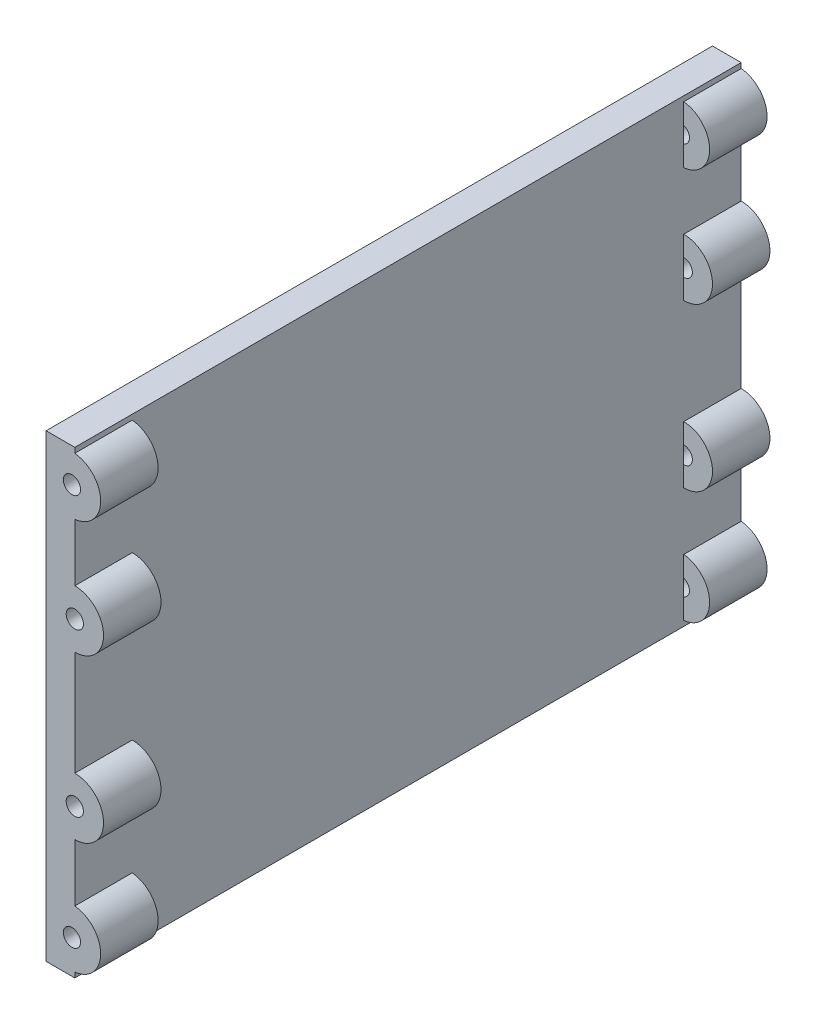
ISO-10303-21;
HEADER;
FILE_DESCRIPTION(('STEP AP214'),'2;1');
FILE_NAME('part.step','',(''),(''),'','','');
FILE_SCHEMA(('AUTOMOTIVE_DESIGN { 1 0 10303 214 1 1 1 1 }'));
ENDSEC;
DATA;
#1=APPLICATION_CONTEXT('core data for automotive mechanical design processes');
#2=APPLICATION_PROTOCOL_DEFINITION('international standard','automotive_design',2000,#1);
#3=PRODUCT_CONTEXT('',#1,'mechanical');
#4=PRODUCT('Part','Part','',(#3));
#5=PRODUCT_RELATED_PRODUCT_CATEGORY('part','',(#4));
#6=PRODUCT_DEFINITION_FORMATION('','',#4);
#7=PRODUCT_DEFINITION_CONTEXT('part definition',#1,'design');
#8=PRODUCT_DEFINITION('design','',#6,#7);
#9=PRODUCT_DEFINITION_SHAPE('','',#8);
#10=(LENGTH_UNIT() NAMED_UNIT(*) SI_UNIT(.MILLI.,.METRE.));
#11=(NAMED_UNIT(*) PLANE_ANGLE_UNIT() SI_UNIT($,.RADIAN.));
#12=(NAMED_UNIT(*) SI_UNIT($,.STERADIAN.) SOLID_ANGLE_UNIT());
#13=UNCERTAINTY_MEASURE_WITH_UNIT(LENGTH_MEASURE(1.E-05),#10,'distance_accuracy_value','');
#14=(GEOMETRIC_REPRESENTATION_CONTEXT(3) GLOBAL_UNCERTAINTY_ASSIGNED_CONTEXT((#13)) GLOBAL_UNIT_ASSIGNED_CONTEXT((#10,
#11,#12)) REPRESENTATION_CONTEXT('',''));
#15=CARTESIAN_POINT('',(0.,0.,0.));
#16=DIRECTION('',(0.,0.,1.));
#17=DIRECTION('',(1.,0.,0.));
#18=AXIS2_PLACEMENT_3D('',#15,#16,#17);
#19=CARTESIAN_POINT('',(5.,0.,0.));
#20=DIRECTION('',(-1.,0.,0.));
#21=DIRECTION('',(0.,0.,1.));
#22=AXIS2_PLACEMENT_3D('',#19,#20,#21);
#23=PLANE('',#22);
#24=DIRECTION('',(0.,1.,0.));
#25=VECTOR('',#24,1.);
#26=CARTESIAN_POINT('',(5.,0.,-9.99999999999999));
#27=LINE('',#26,#25);
#28=CARTESIAN_POINT('',(5.,4.46125075255755,-9.99999999999999));
#29=VERTEX_POINT('',#28);
#30=CARTESIAN_POINT('',(5.,7.28967787730365,-9.99999999999999));
#31=VERTEX_POINT('',#30);
#32=EDGE_CURVE('E221',#29,#31,#27,.T.);
#33=ORIENTED_EDGE('',*,*,#32,.F.);
#34=DIRECTION('',(0.,1.,0.));
#35=VECTOR('',#34,1.);
#36=CARTESIAN_POINT('',(5.,0.,-10.));
#37=LINE('',#36,#35);
#38=CARTESIAN_POINT('',(5.,0.900527129397512,-10.));
#39=VERTEX_POINT('',#38);
#40=EDGE_CURVE('E244',#39,#29,#37,.T.);
#41=ORIENTED_EDGE('',*,*,#40,.F.);
#42=DIRECTION('',(0.,0.,1.));
#43=VECTOR('',#42,1.);
#44=CARTESIAN_POINT('',(5.,0.900527129397512,-10.));
#45=LINE('',#44,#43);
#46=CARTESIAN_POINT('',(5.,0.900527129397512,0.));
#47=VERTEX_POINT('',#46);
#48=EDGE_CURVE('E251',#47,#39,#45,.F.);
#49=ORIENTED_EDGE('',*,*,#48,.F.);
#50=DIRECTION('',(0.,-1.,0.));
#51=VECTOR('',#50,1.);
#52=CARTESIAN_POINT('',(5.,0.,0.));
#53=LINE('',#52,#51);
#54=CARTESIAN_POINT('',(5.,0.,0.));
#55=VERTEX_POINT('',#54);
#56=EDGE_CURVE('E414',#47,#55,#53,.T.);
#57=ORIENTED_EDGE('',*,*,#56,.T.);
#58=DIRECTION('',(0.,0.,-1.));
#59=VECTOR('',#58,1.);
#60=CARTESIAN_POINT('',(5.,0.,0.));
#61=LINE('',#60,#59);
#62=CARTESIAN_POINT('',(5.,0.,-116.));
#63=VERTEX_POINT('',#62);
#64=EDGE_CURVE('E412',#55,#63,#61,.T.);
#65=ORIENTED_EDGE('',*,*,#64,.T.);
#66=DIRECTION('',(0.,1.,0.));
#67=VECTOR('',#66,1.);
#68=CARTESIAN_POINT('',(5.,0.,-116.));
#69=LINE('',#68,#67);
#70=CARTESIAN_POINT('',(5.,0.900527129397512,-116.));
#71=VERTEX_POINT('',#70);
#72=EDGE_CURVE('E418',#63,#71,#69,.T.);
#73=ORIENTED_EDGE('',*,*,#72,.T.);
#74=DIRECTION('',(0.,0.,-1.));
#75=VECTOR('',#74,1.);
#76=CARTESIAN_POINT('',(5.,0.900527129397512,-106.));
#77=LINE('',#76,#75);
#78=CARTESIAN_POINT('',(5.,0.900527129397512,-106.));
#79=VERTEX_POINT('',#78);
#80=EDGE_CURVE('E344',#71,#79,#77,.F.);
#81=ORIENTED_EDGE('',*,*,#80,.T.);
#82=DIRECTION('',(0.,-1.,0.));
#83=VECTOR('',#82,1.);
#84=CARTESIAN_POINT('',(5.,0.,-106.));
#85=LINE('',#84,#83);
#86=CARTESIAN_POINT('',(5.,4.46125075255755,-106.));
#87=VERTEX_POINT('',#86);
#88=EDGE_CURVE('E339',#87,#79,#85,.T.);
#89=ORIENTED_EDGE('',*,*,#88,.F.);
#90=DIRECTION('',(0.,-1.,0.));
#91=VECTOR('',#90,1.);
#92=CARTESIAN_POINT('',(5.,0.,-106.));
#93=LINE('',#92,#91);
#94=CARTESIAN_POINT('',(5.,7.28967787730365,-106.));
#95=VERTEX_POINT('',#94);
#96=EDGE_CURVE('E321',#95,#87,#93,.T.);
#97=ORIENTED_EDGE('',*,*,#96,.F.);
#98=CARTESIAN_POINT('',(5.,10.8504015004637,-106.));
#99=VERTEX_POINT('',#98);
#100=EDGE_CURVE('E52',#99,#95,#85,.T.);
#101=ORIENTED_EDGE('',*,*,#100,.F.);
#102=DIRECTION('',(0.,0.,-1.));
#103=VECTOR('',#102,1.);
#104=CARTESIAN_POINT('',(5.,10.8504015004637,-106.));
#105=LINE('',#104,#103);
#106=CARTESIAN_POINT('',(5.,10.8504015004637,-116.));
#107=VERTEX_POINT('',#106);
#108=EDGE_CURVE('E346',#99,#107,#105,.T.);
#109=ORIENTED_EDGE('',*,*,#108,.T.);
#110=CARTESIAN_POINT('',(5.,20.8754643149307,-116.));
#111=VERTEX_POINT('',#110);
#112=EDGE_CURVE('E421',#107,#111,#69,.T.);
#113=ORIENTED_EDGE('',*,*,#112,.T.);
#114=DIRECTION('',(0.,0.,-1.));
#115=VECTOR('',#114,1.);
#116=CARTESIAN_POINT('',(5.,20.8754643149307,-106.));
#117=LINE('',#116,#115);
#118=CARTESIAN_POINT('',(5.,20.8754643149307,-106.));
#119=VERTEX_POINT('',#118);
#120=EDGE_CURVE('E404',#111,#119,#117,.F.);
#121=ORIENTED_EDGE('',*,*,#120,.T.);
#122=DIRECTION('',(0.,-1.,0.));
#123=VECTOR('',#122,1.);
#124=CARTESIAN_POINT('',(5.,0.,-106.));
#125=LINE('',#124,#123);
#126=CARTESIAN_POINT('',(5.,24.3754643149307,-106.));
#127=VERTEX_POINT('',#126);
#128=EDGE_CURVE('E398',#127,#119,#125,.T.);
#129=ORIENTED_EDGE('',*,*,#128,.F.);
#130=DIRECTION('',(0.,-1.,0.));
#131=VECTOR('',#130,1.);
#132=CARTESIAN_POINT('',(5.,0.,-106.));
#133=LINE('',#132,#131);
#134=CARTESIAN_POINT('',(5.,27.3754643149307,-106.));
#135=VERTEX_POINT('',#134);
#136=EDGE_CURVE('E327',#135,#127,#133,.T.);
#137=ORIENTED_EDGE('',*,*,#136,.F.);
#138=CARTESIAN_POINT('',(5.,30.8754643149307,-106.));
#139=VERTEX_POINT('',#138);
#140=EDGE_CURVE('E403',#139,#135,#125,.T.);
#141=ORIENTED_EDGE('',*,*,#140,.F.);
#142=DIRECTION('',(0.,0.,-1.));
#143=VECTOR('',#142,1.);
#144=CARTESIAN_POINT('',(5.,30.8754643149307,-106.));
#145=LINE('',#144,#143);
#146=CARTESIAN_POINT('',(5.,30.8754643149307,-116.));
#147=VERTEX_POINT('',#146);
#148=EDGE_CURVE('E406',#139,#147,#145,.T.);
#149=ORIENTED_EDGE('',*,*,#148,.T.);
#150=CARTESIAN_POINT('',(5.,49.1245356850693,-116.));
#151=VERTEX_POINT('',#150);
#152=EDGE_CURVE('E422',#147,#151,#69,.T.);
#153=ORIENTED_EDGE('',*,*,#152,.T.);
#154=DIRECTION('',(0.,0.,-1.));
#155=VECTOR('',#154,1.);
#156=CARTESIAN_POINT('',(5.,49.1245356850693,-106.));
#157=LINE('',#156,#155);
#158=CARTESIAN_POINT('',(5.,49.1245356850693,-106.));
#159=VERTEX_POINT('',#158);
#160=EDGE_CURVE('E364',#151,#159,#157,.F.);
#161=ORIENTED_EDGE('',*,*,#160,.T.);
#162=DIRECTION('',(0.,-1.,0.));
#163=VECTOR('',#162,1.);
#164=CARTESIAN_POINT('',(5.,0.,-106.));
#165=LINE('',#164,#163);
#166=CARTESIAN_POINT('',(5.,52.6245356850693,-106.));
#167=VERTEX_POINT('',#166);
#168=EDGE_CURVE('E358',#167,#159,#165,.T.);
#169=ORIENTED_EDGE('',*,*,#168,.F.);
#170=DIRECTION('',(0.,-1.,0.));
#171=VECTOR('',#170,1.);
#172=CARTESIAN_POINT('',(5.,0.,-106.));
#173=LINE('',#172,#171);
#174=CARTESIAN_POINT('',(5.,55.6245356850693,-106.));
#175=VERTEX_POINT('',#174);
#176=EDGE_CURVE('E323',#175,#167,#173,.T.);
#177=ORIENTED_EDGE('',*,*,#176,.F.);
#178=CARTESIAN_POINT('',(5.,59.1245356850693,-106.));
#179=VERTEX_POINT('',#178);
#180=EDGE_CURVE('E363',#179,#175,#165,.T.);
#181=ORIENTED_EDGE('',*,*,#180,.F.);
#182=DIRECTION('',(0.,0.,-1.));
#183=VECTOR('',#182,1.);
#184=CARTESIAN_POINT('',(5.,59.1245356850693,-106.));
#185=LINE('',#184,#183);
#186=CARTESIAN_POINT('',(5.,59.1245356850693,-116.));
#187=VERTEX_POINT('',#186);
#188=EDGE_CURVE('E366',#179,#187,#185,.T.);
#189=ORIENTED_EDGE('',*,*,#188,.T.);
#190=CARTESIAN_POINT('',(5.,69.1495984995363,-116.));
#191=VERTEX_POINT('',#190);
#192=EDGE_CURVE('E466',#187,#191,#69,.T.);
#193=ORIENTED_EDGE('',*,*,#192,.T.);
#194=DIRECTION('',(0.,0.,-1.));
#195=VECTOR('',#194,1.);
#196=CARTESIAN_POINT('',(5.,69.1495984995363,-106.));
#197=LINE('',#196,#195);
#198=CARTESIAN_POINT('',(5.,69.1495984995363,-106.));
#199=VERTEX_POINT('',#198);
#200=EDGE_CURVE('E384',#191,#199,#197,.F.);
#201=ORIENTED_EDGE('',*,*,#200,.T.);
#202=DIRECTION('',(0.,-1.,0.));
#203=VECTOR('',#202,1.);
#204=CARTESIAN_POINT('',(5.,0.,-106.));
#205=LINE('',#204,#203);
#206=CARTESIAN_POINT('',(5.,72.7103221226963,-106.));
#207=VERTEX_POINT('',#206);
#208=EDGE_CURVE('E378',#207,#199,#205,.T.);
#209=ORIENTED_EDGE('',*,*,#208,.F.);
#210=DIRECTION('',(0.,-1.,0.));
#211=VECTOR('',#210,1.);
#212=CARTESIAN_POINT('',(5.,0.,-106.));
#213=LINE('',#212,#211);
#214=CARTESIAN_POINT('',(5.,75.5387492474426,-106.));
#215=VERTEX_POINT('',#214);
#216=EDGE_CURVE('E325',#215,#207,#213,.T.);
#217=ORIENTED_EDGE('',*,*,#216,.F.);
#218=CARTESIAN_POINT('',(5.,79.0994728706025,-106.));
#219=VERTEX_POINT('',#218);
#220=EDGE_CURVE('E383',#219,#215,#205,.T.);
#221=ORIENTED_EDGE('',*,*,#220,.F.);
#222=DIRECTION('',(0.,0.,-1.));
#223=VECTOR('',#222,1.);
#224=CARTESIAN_POINT('',(5.,79.0994728706025,-106.));
#225=LINE('',#224,#223);
#226=CARTESIAN_POINT('',(5.,79.0994728706025,-116.));
#227=VERTEX_POINT('',#226);
#228=EDGE_CURVE('E386',#219,#227,#225,.T.);
#229=ORIENTED_EDGE('',*,*,#228,.T.);
#230=CARTESIAN_POINT('',(5.,80.,-116.));
#231=VERTEX_POINT('',#230);
#232=EDGE_CURVE('E417',#227,#231,#69,.T.);
#233=ORIENTED_EDGE('',*,*,#232,.T.);
#234=DIRECTION('',(0.,0.,1.));
#235=VECTOR('',#234,1.);
#236=CARTESIAN_POINT('',(5.,80.,0.));
#237=LINE('',#236,#235);
#238=CARTESIAN_POINT('',(5.,80.,0.));
#239=VERTEX_POINT('',#238);
#240=EDGE_CURVE('E420',#231,#239,#237,.T.);
#241=ORIENTED_EDGE('',*,*,#240,.T.);
#242=CARTESIAN_POINT('',(5.,79.0994728706025,0.));
#243=VERTEX_POINT('',#242);
#244=EDGE_CURVE('E409',#239,#243,#53,.T.);
#245=ORIENTED_EDGE('',*,*,#244,.T.);
#246=DIRECTION('',(0.,0.,1.));
#247=VECTOR('',#246,1.);
#248=CARTESIAN_POINT('',(5.,79.0994728706025,-10.));
#249=LINE('',#248,#247);
#250=CARTESIAN_POINT('',(5.,79.0994728706025,-10.));
#251=VERTEX_POINT('',#250);
#252=EDGE_CURVE('E284',#251,#243,#249,.T.);
#253=ORIENTED_EDGE('',*,*,#252,.F.);
#254=DIRECTION('',(0.,1.,0.));
#255=VECTOR('',#254,1.);
#256=CARTESIAN_POINT('',(5.,0.,-10.));
#257=LINE('',#256,#255);
#258=CARTESIAN_POINT('',(5.,75.5387492474426,-9.99999999999999));
#259=VERTEX_POINT('',#258);
#260=EDGE_CURVE('E289',#259,#251,#257,.T.);
#261=ORIENTED_EDGE('',*,*,#260,.F.);
#262=DIRECTION('',(0.,1.,0.));
#263=VECTOR('',#262,1.);
#264=CARTESIAN_POINT('',(5.,0.,-9.99999999999999));
#265=LINE('',#264,#263);
#266=CARTESIAN_POINT('',(5.,72.7103221226963,-9.99999999999999));
#267=VERTEX_POINT('',#266);
#268=EDGE_CURVE('E573',#267,#259,#265,.T.);
#269=ORIENTED_EDGE('',*,*,#268,.F.);
#270=CARTESIAN_POINT('',(5.,69.1495984995363,-10.));
#271=VERTEX_POINT('',#270);
#272=EDGE_CURVE('E291',#271,#267,#257,.T.);
#273=ORIENTED_EDGE('',*,*,#272,.F.);
#274=DIRECTION('',(0.,0.,1.));
#275=VECTOR('',#274,1.);
#276=CARTESIAN_POINT('',(5.,69.1495984995363,-10.));
#277=LINE('',#276,#275);
#278=CARTESIAN_POINT('',(5.,69.1495984995363,0.));
#279=VERTEX_POINT('',#278);
#280=EDGE_CURVE('E287',#279,#271,#277,.F.);
#281=ORIENTED_EDGE('',*,*,#280,.F.);
#282=CARTESIAN_POINT('',(5.,59.1245356850693,0.));
#283=VERTEX_POINT('',#282);
#284=EDGE_CURVE('E413',#279,#283,#53,.T.);
#285=ORIENTED_EDGE('',*,*,#284,.T.);
#286=DIRECTION('',(0.,0.,1.));
#287=VECTOR('',#286,1.);
#288=CARTESIAN_POINT('',(5.,59.1245356850693,-10.));
#289=LINE('',#288,#287);
#290=CARTESIAN_POINT('',(5.,59.1245356850693,-10.));
#291=VERTEX_POINT('',#290);
#292=EDGE_CURVE('E266',#291,#283,#289,.T.);
#293=ORIENTED_EDGE('',*,*,#292,.F.);
#294=DIRECTION('',(0.,1.,0.));
#295=VECTOR('',#294,1.);
#296=CARTESIAN_POINT('',(5.,0.,-10.));
#297=LINE('',#296,#295);
#298=CARTESIAN_POINT('',(5.,55.6245356850693,-9.99999999999999));
#299=VERTEX_POINT('',#298);
#300=EDGE_CURVE('E271',#299,#291,#297,.T.);
#301=ORIENTED_EDGE('',*,*,#300,.F.);
#302=DIRECTION('',(0.,1.,0.));
#303=VECTOR('',#302,1.);
#304=CARTESIAN_POINT('',(5.,0.,-9.99999999999999));
#305=LINE('',#304,#303);
#306=CARTESIAN_POINT('',(5.,52.6245356850693,-9.99999999999999));
#307=VERTEX_POINT('',#306);
#308=EDGE_CURVE('E228',#307,#299,#305,.T.);
#309=ORIENTED_EDGE('',*,*,#308,.F.);
#310=CARTESIAN_POINT('',(5.,49.1245356850693,-10.));
#311=VERTEX_POINT('',#310);
#312=EDGE_CURVE('E273',#311,#307,#297,.T.);
#313=ORIENTED_EDGE('',*,*,#312,.F.);
#314=DIRECTION('',(0.,0.,1.));
#315=VECTOR('',#314,1.);
#316=CARTESIAN_POINT('',(5.,49.1245356850693,-10.));
#317=LINE('',#316,#315);
#318=CARTESIAN_POINT('',(5.,49.1245356850693,0.));
#319=VERTEX_POINT('',#318);
#320=EDGE_CURVE('E269',#319,#311,#317,.F.);
#321=ORIENTED_EDGE('',*,*,#320,.F.);
#322=CARTESIAN_POINT('',(5.,30.8754643149307,0.));
#323=VERTEX_POINT('',#322);
#324=EDGE_CURVE('E542',#319,#323,#53,.T.);
#325=ORIENTED_EDGE('',*,*,#324,.T.);
#326=DIRECTION('',(0.,0.,1.));
#327=VECTOR('',#326,1.);
#328=CARTESIAN_POINT('',(5.,30.8754643149307,-10.));
#329=LINE('',#328,#327);
#330=CARTESIAN_POINT('',(5.,30.8754643149307,-10.));
#331=VERTEX_POINT('',#330);
#332=EDGE_CURVE('E302',#331,#323,#329,.T.);
#333=ORIENTED_EDGE('',*,*,#332,.F.);
#334=DIRECTION('',(0.,1.,0.));
#335=VECTOR('',#334,1.);
#336=CARTESIAN_POINT('',(5.,0.,-10.));
#337=LINE('',#336,#335);
#338=CARTESIAN_POINT('',(5.,27.3754643149307,-9.99999999999999));
#339=VERTEX_POINT('',#338);
#340=EDGE_CURVE('E308',#339,#331,#337,.T.);
#341=ORIENTED_EDGE('',*,*,#340,.F.);
#342=DIRECTION('',(0.,1.,0.));
#343=VECTOR('',#342,1.);
#344=CARTESIAN_POINT('',(5.,0.,-9.99999999999999));
#345=LINE('',#344,#343);
#346=CARTESIAN_POINT('',(5.,24.3754643149307,-9.99999999999999));
#347=VERTEX_POINT('',#346);
#348=EDGE_CURVE('E575',#347,#339,#345,.T.);
#349=ORIENTED_EDGE('',*,*,#348,.F.);
#350=CARTESIAN_POINT('',(5.,20.8754643149307,-10.));
#351=VERTEX_POINT('',#350);
#352=EDGE_CURVE('E310',#351,#347,#337,.T.);
#353=ORIENTED_EDGE('',*,*,#352,.F.);
#354=DIRECTION('',(0.,0.,1.));
#355=VECTOR('',#354,1.);
#356=CARTESIAN_POINT('',(5.,20.8754643149307,-10.));
#357=LINE('',#356,#355);
#358=CARTESIAN_POINT('',(5.,20.8754643149307,0.));
#359=VERTEX_POINT('',#358);
#360=EDGE_CURVE('E306',#359,#351,#357,.F.);
#361=ORIENTED_EDGE('',*,*,#360,.F.);
#362=CARTESIAN_POINT('',(5.,10.8504015004637,0.));
#363=VERTEX_POINT('',#362);
#364=EDGE_CURVE('E415',#359,#363,#53,.T.);
#365=ORIENTED_EDGE('',*,*,#364,.T.);
#366=DIRECTION('',(0.,0.,1.));
#367=VECTOR('',#366,1.);
#368=CARTESIAN_POINT('',(5.,10.8504015004637,-10.));
#369=LINE('',#368,#367);
#370=CARTESIAN_POINT('',(5.,10.8504015004637,-10.));
#371=VERTEX_POINT('',#370);
#372=EDGE_CURVE('E250',#371,#363,#369,.T.);
#373=ORIENTED_EDGE('',*,*,#372,.F.);
#374=EDGE_CURVE('E242',#31,#371,#37,.T.);
#375=ORIENTED_EDGE('',*,*,#374,.F.);
#376=EDGE_LOOP('',(#33,#41,#49,#57,#65,#73,#81,#89,#97,#101,#109,#113,#121,#129,#137,#141,#149,
#153,#161,#169,#177,#181,#189,#193,#201,#209,#217,#221,#229,#233,#241,#245,#253,#261,#269,#273,
#281,#285,#293,#301,#309,#313,#321,#325,#333,#341,#349,#353,#361,#365,#373,#375));
#377=FACE_BOUND('',#376,.T.);
#378=ADVANCED_FACE('F37',(#377),#23,.F.);
#379=CARTESIAN_POINT('',(5.,0.,0.));
#380=DIRECTION('',(0.,0.,-1.));
#381=DIRECTION('',(-1.,0.,0.));
#382=AXIS2_PLACEMENT_3D('',#379,#380,#381);
#383=PLANE('',#382);
#384=CARTESIAN_POINT('',(4.49999999999986,5.8754643149306,0.));
#385=DIRECTION('',(0.,0.,-1.));
#386=DIRECTION('',(-1.,0.,0.));
#387=AXIS2_PLACEMENT_3D('',#384,#385,#386);
#388=CIRCLE('',#387,1.5);
#389=CARTESIAN_POINT('',(2.99999999999986,5.8754643149306,0.));
#390=VERTEX_POINT('',#389);
#391=EDGE_CURVE('E246',#390,#390,#388,.T.);
#392=ORIENTED_EDGE('',*,*,#391,.T.);
#393=EDGE_LOOP('',(#392));
#394=FACE_BOUND('',#393,.T.);
#395=CARTESIAN_POINT('',(4.50000000000009,74.1245356850694,0.));
#396=DIRECTION('',(0.,0.,-1.));
#397=DIRECTION('',(-1.,0.,0.));
#398=AXIS2_PLACEMENT_3D('',#395,#396,#397);
#399=CIRCLE('',#398,1.5);
#400=CARTESIAN_POINT('',(3.00000000000009,74.1245356850694,0.));
#401=VERTEX_POINT('',#400);
#402=EDGE_CURVE('E278',#401,#401,#399,.T.);
#403=ORIENTED_EDGE('',*,*,#402,.T.);
#404=EDGE_LOOP('',(#403));
#405=FACE_BOUND('',#404,.T.);
#406=CARTESIAN_POINT('',(5.00000000000011,54.1245356850693,0.));
#407=DIRECTION('',(0.,0.,-1.));
#408=DIRECTION('',(-1.,0.,0.));
#409=AXIS2_PLACEMENT_3D('',#406,#407,#408);
#410=CIRCLE('',#409,1.5);
#411=CARTESIAN_POINT('',(3.50000000000011,54.1245356850693,0.));
#412=VERTEX_POINT('',#411);
#413=EDGE_CURVE('E253',#412,#412,#410,.T.);
#414=ORIENTED_EDGE('',*,*,#413,.T.);
#415=EDGE_LOOP('',(#414));
#416=FACE_BOUND('',#415,.T.);
#417=CARTESIAN_POINT('',(5.00000000000001,25.8754643149307,0.));
#418=DIRECTION('',(0.,0.,-1.));
#419=DIRECTION('',(-1.,0.,0.));
#420=AXIS2_PLACEMENT_3D('',#417,#418,#419);
#421=CIRCLE('',#420,1.50000000000001);
#422=CARTESIAN_POINT('',(3.50000000000001,25.8754643149307,0.));
#423=VERTEX_POINT('',#422);
#424=EDGE_CURVE('E296',#423,#423,#421,.T.);
#425=ORIENTED_EDGE('',*,*,#424,.T.);
#426=EDGE_LOOP('',(#425));
#427=FACE_BOUND('',#426,.T.);
#428=DIRECTION('',(0.,-1.,0.));
#429=VECTOR('',#428,1.);
#430=CARTESIAN_POINT('',(0.,0.,0.));
#431=LINE('',#430,#429);
#432=CARTESIAN_POINT('',(0.,80.,0.));
#433=VERTEX_POINT('',#432);
#434=CARTESIAN_POINT('',(0.,0.,0.));
#435=VERTEX_POINT('',#434);
#436=EDGE_CURVE('E408',#433,#435,#431,.T.);
#437=ORIENTED_EDGE('',*,*,#436,.T.);
#438=DIRECTION('',(-1.,0.,0.));
#439=VECTOR('',#438,1.);
#440=CARTESIAN_POINT('',(5.,0.,0.));
#441=LINE('',#440,#439);
#442=EDGE_CURVE('E11',#55,#435,#441,.T.);
#443=ORIENTED_EDGE('',*,*,#442,.F.);
#444=ORIENTED_EDGE('',*,*,#56,.F.);
#445=CARTESIAN_POINT('',(4.49999999999986,5.8754643149306,0.));
#446=DIRECTION('',(0.,0.,-1.));
#447=DIRECTION('',(-1.,0.,0.));
#448=AXIS2_PLACEMENT_3D('',#445,#446,#447);
#449=CIRCLE('',#448,5.);
#450=EDGE_CURVE('E245',#363,#47,#449,.T.);
#451=ORIENTED_EDGE('',*,*,#450,.F.);
#452=ORIENTED_EDGE('',*,*,#364,.F.);
#453=CARTESIAN_POINT('',(5.00000000000001,25.8754643149307,0.));
#454=DIRECTION('',(0.,0.,-1.));
#455=DIRECTION('',(-1.,0.,0.));
#456=AXIS2_PLACEMENT_3D('',#453,#454,#455);
#457=CIRCLE('',#456,5.);
#458=EDGE_CURVE('E295',#323,#359,#457,.T.);
#459=ORIENTED_EDGE('',*,*,#458,.F.);
#460=ORIENTED_EDGE('',*,*,#324,.F.);
#461=CARTESIAN_POINT('',(5.00000000000011,54.1245356850693,0.));
#462=DIRECTION('',(0.,0.,-1.));
#463=DIRECTION('',(-1.,0.,0.));
#464=AXIS2_PLACEMENT_3D('',#461,#462,#463);
#465=CIRCLE('',#464,5.);
#466=EDGE_CURVE('E260',#283,#319,#465,.T.);
#467=ORIENTED_EDGE('',*,*,#466,.F.);
#468=ORIENTED_EDGE('',*,*,#284,.F.);
#469=CARTESIAN_POINT('',(4.50000000000009,74.1245356850694,0.));
#470=DIRECTION('',(0.,0.,-1.));
#471=DIRECTION('',(-1.,0.,0.));
#472=AXIS2_PLACEMENT_3D('',#469,#470,#471);
#473=CIRCLE('',#472,5.);
#474=EDGE_CURVE('E277',#243,#279,#473,.T.);
#475=ORIENTED_EDGE('',*,*,#474,.F.);
#476=ORIENTED_EDGE('',*,*,#244,.F.);
#477=DIRECTION('',(-1.,0.,0.));
#478=VECTOR('',#477,1.);
#479=CARTESIAN_POINT('',(5.,80.,0.));
#480=LINE('',#479,#478);
#481=EDGE_CURVE('E424',#239,#433,#480,.T.);
#482=ORIENTED_EDGE('',*,*,#481,.T.);
#483=EDGE_LOOP('',(#437,#443,#444,#451,#452,#459,#460,#467,#468,#475,#476,#482));
#484=FACE_BOUND('',#483,.T.);
#485=ADVANCED_FACE('F39',(#394,#405,#416,#427,#484),#383,.F.);
#486=CARTESIAN_POINT('',(5.,0.,0.));
#487=DIRECTION('',(0.,1.,0.));
#488=DIRECTION('',(0.,0.,1.));
#489=AXIS2_PLACEMENT_3D('',#486,#487,#488);
#490=PLANE('',#489);
#491=DIRECTION('',(0.,0.,-1.));
#492=VECTOR('',#491,1.);
#493=CARTESIAN_POINT('',(0.,0.,0.));
#494=LINE('',#493,#492);
#495=CARTESIAN_POINT('',(0.,0.,-116.));
#496=VERTEX_POINT('',#495);
#497=EDGE_CURVE('E426',#435,#496,#494,.T.);
#498=ORIENTED_EDGE('',*,*,#497,.T.);
#499=DIRECTION('',(-1.,0.,0.));
#500=VECTOR('',#499,1.);
#501=CARTESIAN_POINT('',(5.,0.,-116.));
#502=LINE('',#501,#500);
#503=EDGE_CURVE('E45',#63,#496,#502,.T.);
#504=ORIENTED_EDGE('',*,*,#503,.F.);
#505=ORIENTED_EDGE('',*,*,#64,.F.);
#506=ORIENTED_EDGE('',*,*,#442,.T.);
#507=EDGE_LOOP('',(#498,#504,#505,#506));
#508=FACE_BOUND('',#507,.T.);
#509=ADVANCED_FACE('F525',(#508),#490,.F.);
#510=CARTESIAN_POINT('',(5.,0.,-116.));
#511=DIRECTION('',(0.,0.,1.));
#512=DIRECTION('',(1.,0.,0.));
#513=AXIS2_PLACEMENT_3D('',#510,#511,#512);
#514=PLANE('',#513);
#515=ORIENTED_EDGE('',*,*,#112,.F.);
#516=CARTESIAN_POINT('',(4.49999999999986,5.8754643149306,-116.));
#517=DIRECTION('',(0.,0.,-1.));
#518=DIRECTION('',(-1.,0.,0.));
#519=AXIS2_PLACEMENT_3D('',#516,#517,#518);
#520=CIRCLE('',#519,5.);
#521=EDGE_CURVE('E330',#107,#71,#520,.T.);
#522=ORIENTED_EDGE('',*,*,#521,.T.);
#523=ORIENTED_EDGE('',*,*,#72,.F.);
#524=ORIENTED_EDGE('',*,*,#503,.T.);
#525=DIRECTION('',(0.,1.,0.));
#526=VECTOR('',#525,1.);
#527=CARTESIAN_POINT('',(0.,0.,-116.));
#528=LINE('',#527,#526);
#529=CARTESIAN_POINT('',(0.,80.,-116.));
#530=VERTEX_POINT('',#529);
#531=EDGE_CURVE('E428',#496,#530,#528,.T.);
#532=ORIENTED_EDGE('',*,*,#531,.T.);
#533=DIRECTION('',(-1.,0.,0.));
#534=VECTOR('',#533,1.);
#535=CARTESIAN_POINT('',(5.,80.,-116.));
#536=LINE('',#535,#534);
#537=EDGE_CURVE('E434',#231,#530,#536,.T.);
#538=ORIENTED_EDGE('',*,*,#537,.F.);
#539=ORIENTED_EDGE('',*,*,#232,.F.);
#540=CARTESIAN_POINT('',(4.50000000000009,74.1245356850694,-116.));
#541=DIRECTION('',(0.,0.,-1.));
#542=DIRECTION('',(-1.,0.,0.));
#543=AXIS2_PLACEMENT_3D('',#540,#541,#542);
#544=CIRCLE('',#543,5.);
#545=EDGE_CURVE('E369',#227,#191,#544,.T.);
#546=ORIENTED_EDGE('',*,*,#545,.T.);
#547=ORIENTED_EDGE('',*,*,#192,.F.);
#548=CARTESIAN_POINT('',(5.00000000000011,54.1245356850693,-116.));
#549=DIRECTION('',(0.,0.,-1.));
#550=DIRECTION('',(-1.,0.,0.));
#551=AXIS2_PLACEMENT_3D('',#548,#549,#550);
#552=CIRCLE('',#551,5.);
#553=EDGE_CURVE('E349',#187,#151,#552,.T.);
#554=ORIENTED_EDGE('',*,*,#553,.T.);
#555=ORIENTED_EDGE('',*,*,#152,.F.);
#556=CARTESIAN_POINT('',(5.00000000000001,25.8754643149307,-116.));
#557=DIRECTION('',(0.,0.,-1.));
#558=DIRECTION('',(-1.,0.,0.));
#559=AXIS2_PLACEMENT_3D('',#556,#557,#558);
#560=CIRCLE('',#559,5.);
#561=EDGE_CURVE('E392',#147,#111,#560,.T.);
#562=ORIENTED_EDGE('',*,*,#561,.T.);
#563=EDGE_LOOP('',(#515,#522,#523,#524,#532,#538,#539,#546,#547,#554,#555,#562));
#564=FACE_BOUND('',#563,.T.);
#565=CARTESIAN_POINT('',(5.00000000000001,25.8754643149307,-116.));
#566=DIRECTION('',(0.,0.,-1.));
#567=DIRECTION('',(-1.,0.,0.));
#568=AXIS2_PLACEMENT_3D('',#565,#566,#567);
#569=CIRCLE('',#568,1.50000000000001);
#570=CARTESIAN_POINT('',(3.50000000000001,25.8754643149307,-116.));
#571=VERTEX_POINT('',#570);
#572=EDGE_CURVE('E388',#571,#571,#569,.T.);
#573=ORIENTED_EDGE('',*,*,#572,.F.);
#574=EDGE_LOOP('',(#573));
#575=FACE_BOUND('',#574,.T.);
#576=CARTESIAN_POINT('',(5.00000000000011,54.1245356850693,-116.));
#577=DIRECTION('',(0.,0.,-1.));
#578=DIRECTION('',(-1.,0.,0.));
#579=AXIS2_PLACEMENT_3D('',#576,#577,#578);
#580=CIRCLE('',#579,1.5);
#581=CARTESIAN_POINT('',(3.50000000000011,54.1245356850693,-116.));
#582=VERTEX_POINT('',#581);
#583=EDGE_CURVE('E355',#582,#582,#580,.T.);
#584=ORIENTED_EDGE('',*,*,#583,.F.);
#585=EDGE_LOOP('',(#584));
#586=FACE_BOUND('',#585,.T.);
#587=CARTESIAN_POINT('',(4.50000000000009,74.1245356850694,-116.));
#588=DIRECTION('',(0.,0.,-1.));
#589=DIRECTION('',(-1.,0.,0.));
#590=AXIS2_PLACEMENT_3D('',#587,#588,#589);
#591=CIRCLE('',#590,1.5);
#592=CARTESIAN_POINT('',(3.00000000000009,74.1245356850694,-116.));
#593=VERTEX_POINT('',#592);
#594=EDGE_CURVE('E375',#593,#593,#591,.T.);
#595=ORIENTED_EDGE('',*,*,#594,.F.);
#596=EDGE_LOOP('',(#595));
#597=FACE_BOUND('',#596,.T.);
#598=CARTESIAN_POINT('',(4.49999999999986,5.8754643149306,-116.));
#599=DIRECTION('',(0.,0.,-1.));
#600=DIRECTION('',(-1.,0.,0.));
#601=AXIS2_PLACEMENT_3D('',#598,#599,#600);
#602=CIRCLE('',#601,1.5);
#603=CARTESIAN_POINT('',(2.99999999999986,5.8754643149306,-116.));
#604=VERTEX_POINT('',#603);
#605=EDGE_CURVE('E336',#604,#604,#602,.T.);
#606=ORIENTED_EDGE('',*,*,#605,.F.);
#607=EDGE_LOOP('',(#606));
#608=FACE_BOUND('',#607,.T.);
#609=ADVANCED_FACE('F442',(#564,#575,#586,#597,#608),#514,.F.);
#610=CARTESIAN_POINT('',(5.,80.,0.));
#611=DIRECTION('',(0.,-1.,0.));
#612=DIRECTION('',(0.,0.,-1.));
#613=AXIS2_PLACEMENT_3D('',#610,#611,#612);
#614=PLANE('',#613);
#615=DIRECTION('',(0.,0.,1.));
#616=VECTOR('',#615,1.);
#617=CARTESIAN_POINT('',(0.,80.,0.));
#618=LINE('',#617,#616);
#619=EDGE_CURVE('E430',#530,#433,#618,.T.);
#620=ORIENTED_EDGE('',*,*,#619,.T.);
#621=ORIENTED_EDGE('',*,*,#481,.F.);
#622=ORIENTED_EDGE('',*,*,#240,.F.);
#623=ORIENTED_EDGE('',*,*,#537,.T.);
#624=EDGE_LOOP('',(#620,#621,#622,#623));
#625=FACE_BOUND('',#624,.T.);
#626=ADVANCED_FACE('F454',(#625),#614,.F.);
#627=CARTESIAN_POINT('',(0.,0.,0.));
#628=DIRECTION('',(-1.,0.,0.));
#629=DIRECTION('',(0.,0.,1.));
#630=AXIS2_PLACEMENT_3D('',#627,#628,#629);
#631=PLANE('',#630);
#632=ORIENTED_EDGE('',*,*,#497,.F.);
#633=ORIENTED_EDGE('',*,*,#436,.F.);
#634=ORIENTED_EDGE('',*,*,#619,.F.);
#635=ORIENTED_EDGE('',*,*,#531,.F.);
#636=EDGE_LOOP('',(#632,#633,#634,#635));
#637=FACE_BOUND('',#636,.T.);
#638=ADVANCED_FACE('F450',(#637),#631,.T.);
#639=CARTESIAN_POINT('',(5.00000000000001,25.8754643149307,-106.));
#640=DIRECTION('',(0.,0.,-1.));
#641=DIRECTION('',(-1.,0.,0.));
#642=AXIS2_PLACEMENT_3D('',#639,#640,#641);
#643=CYLINDRICAL_SURFACE('',#642,1.50000000000001);
#644=ORIENTED_EDGE('',*,*,#572,.T.);
#645=EDGE_LOOP('',(#644));
#646=FACE_BOUND('',#645,.T.);
#647=CARTESIAN_POINT('',(5.00000000000001,25.8754643149307,-106.));
#648=DIRECTION('',(0.,0.,-1.));
#649=DIRECTION('',(-1.,0.,0.));
#650=AXIS2_PLACEMENT_3D('',#647,#648,#649);
#651=CIRCLE('',#650,1.50000000000001);
#652=EDGE_CURVE('E389',#135,#127,#651,.T.);
#653=ORIENTED_EDGE('',*,*,#652,.F.);
#654=CARTESIAN_POINT('',(5.00000000000001,25.8754643149307,-106.));
#655=DIRECTION('',(0.,0.,-1.));
#656=DIRECTION('',(-1.,0.,0.));
#657=AXIS2_PLACEMENT_3D('',#654,#655,#656);
#658=CIRCLE('',#657,1.50000000000001);
#659=EDGE_CURVE('E314',#135,#127,#658,.F.);
#660=ORIENTED_EDGE('',*,*,#659,.T.);
#661=EDGE_LOOP('',(#653,#660));
#662=FACE_BOUND('',#661,.T.);
#663=ADVANCED_FACE('F531',(#646,#662),#643,.F.);
#664=CARTESIAN_POINT('',(5.00000000000001,25.8754643149307,-106.));
#665=DIRECTION('',(0.,0.,-1.));
#666=DIRECTION('',(-1.,0.,0.));
#667=AXIS2_PLACEMENT_3D('',#664,#665,#666);
#668=CYLINDRICAL_SURFACE('',#667,5.);
#669=ORIENTED_EDGE('',*,*,#148,.F.);
#670=CARTESIAN_POINT('',(5.00000000000001,25.8754643149307,-106.));
#671=DIRECTION('',(0.,0.,-1.));
#672=DIRECTION('',(-1.,0.,0.));
#673=AXIS2_PLACEMENT_3D('',#670,#671,#672);
#674=CIRCLE('',#673,5.);
#675=EDGE_CURVE('E395',#139,#119,#674,.T.);
#676=ORIENTED_EDGE('',*,*,#675,.T.);
#677=ORIENTED_EDGE('',*,*,#120,.F.);
#678=ORIENTED_EDGE('',*,*,#561,.F.);
#679=EDGE_LOOP('',(#669,#676,#677,#678));
#680=FACE_BOUND('',#679,.T.);
#681=ADVANCED_FACE('F475',(#680),#668,.T.);
#682=CARTESIAN_POINT('',(5.00000000000001,25.8754643149307,-106.));
#683=DIRECTION('',(0.,0.,-1.));
#684=DIRECTION('',(-1.,0.,0.));
#685=AXIS2_PLACEMENT_3D('',#682,#683,#684);
#686=PLANE('',#685);
#687=ORIENTED_EDGE('',*,*,#675,.F.);
#688=ORIENTED_EDGE('',*,*,#140,.T.);
#689=ORIENTED_EDGE('',*,*,#652,.T.);
#690=ORIENTED_EDGE('',*,*,#128,.T.);
#691=EDGE_LOOP('',(#687,#688,#689,#690));
#692=FACE_BOUND('',#691,.T.);
#693=ADVANCED_FACE('F508',(#692),#686,.F.);
#694=CARTESIAN_POINT('',(4.50000000000009,74.1245356850694,-106.));
#695=DIRECTION('',(0.,0.,-1.));
#696=DIRECTION('',(-1.,0.,0.));
#697=AXIS2_PLACEMENT_3D('',#694,#695,#696);
#698=CYLINDRICAL_SURFACE('',#697,1.5);
#699=ORIENTED_EDGE('',*,*,#594,.T.);
#700=EDGE_LOOP('',(#699));
#701=FACE_BOUND('',#700,.T.);
#702=CARTESIAN_POINT('',(4.50000000000009,74.1245356850694,-106.));
#703=DIRECTION('',(0.,0.,-1.));
#704=DIRECTION('',(-1.,0.,0.));
#705=AXIS2_PLACEMENT_3D('',#702,#703,#704);
#706=CIRCLE('',#705,1.5);
#707=EDGE_CURVE('E372',#215,#207,#706,.T.);
#708=ORIENTED_EDGE('',*,*,#707,.F.);
#709=CARTESIAN_POINT('',(4.50000000000009,74.1245356850694,-106.));
#710=DIRECTION('',(0.,0.,-1.));
#711=DIRECTION('',(-1.,0.,0.));
#712=AXIS2_PLACEMENT_3D('',#709,#710,#711);
#713=CIRCLE('',#712,1.5);
#714=EDGE_CURVE('E315',#215,#207,#713,.F.);
#715=ORIENTED_EDGE('',*,*,#714,.T.);
#716=EDGE_LOOP('',(#708,#715));
#717=FACE_BOUND('',#716,.T.);
#718=ADVANCED_FACE('F506',(#701,#717),#698,.F.);
#719=CARTESIAN_POINT('',(4.50000000000009,74.1245356850694,-106.));
#720=DIRECTION('',(0.,0.,-1.));
#721=DIRECTION('',(-1.,0.,0.));
#722=AXIS2_PLACEMENT_3D('',#719,#720,#721);
#723=CYLINDRICAL_SURFACE('',#722,5.);
#724=ORIENTED_EDGE('',*,*,#228,.F.);
#725=CARTESIAN_POINT('',(4.50000000000009,74.1245356850694,-106.));
#726=DIRECTION('',(0.,0.,-1.));
#727=DIRECTION('',(-1.,0.,0.));
#728=AXIS2_PLACEMENT_3D('',#725,#726,#727);
#729=CIRCLE('',#728,5.);
#730=EDGE_CURVE('E368',#219,#199,#729,.T.);
#731=ORIENTED_EDGE('',*,*,#730,.T.);
#732=ORIENTED_EDGE('',*,*,#200,.F.);
#733=ORIENTED_EDGE('',*,*,#545,.F.);
#734=EDGE_LOOP('',(#724,#731,#732,#733));
#735=FACE_BOUND('',#734,.T.);
#736=ADVANCED_FACE('F496',(#735),#723,.T.);
#737=CARTESIAN_POINT('',(4.50000000000009,74.1245356850694,-106.));
#738=DIRECTION('',(0.,0.,-1.));
#739=DIRECTION('',(-1.,0.,0.));
#740=AXIS2_PLACEMENT_3D('',#737,#738,#739);
#741=PLANE('',#740);
#742=ORIENTED_EDGE('',*,*,#730,.F.);
#743=ORIENTED_EDGE('',*,*,#220,.T.);
#744=ORIENTED_EDGE('',*,*,#707,.T.);
#745=ORIENTED_EDGE('',*,*,#208,.T.);
#746=EDGE_LOOP('',(#742,#743,#744,#745));
#747=FACE_BOUND('',#746,.T.);
#748=ADVANCED_FACE('F500',(#747),#741,.F.);
#749=CARTESIAN_POINT('',(5.00000000000011,54.1245356850693,-106.));
#750=DIRECTION('',(0.,0.,-1.));
#751=DIRECTION('',(-1.,0.,0.));
#752=AXIS2_PLACEMENT_3D('',#749,#750,#751);
#753=CYLINDRICAL_SURFACE('',#752,1.5);
#754=ORIENTED_EDGE('',*,*,#583,.T.);
#755=EDGE_LOOP('',(#754));
#756=FACE_BOUND('',#755,.T.);
#757=CARTESIAN_POINT('',(5.00000000000011,54.1245356850693,-106.));
#758=DIRECTION('',(0.,0.,-1.));
#759=DIRECTION('',(-1.,0.,0.));
#760=AXIS2_PLACEMENT_3D('',#757,#758,#759);
#761=CIRCLE('',#760,1.5);
#762=EDGE_CURVE('E352',#175,#167,#761,.T.);
#763=ORIENTED_EDGE('',*,*,#762,.F.);
#764=CARTESIAN_POINT('',(5.00000000000011,54.1245356850693,-106.));
#765=DIRECTION('',(0.,0.,-1.));
#766=DIRECTION('',(-1.,0.,0.));
#767=AXIS2_PLACEMENT_3D('',#764,#765,#766);
#768=CIRCLE('',#767,1.5);
#769=EDGE_CURVE('E311',#175,#167,#768,.F.);
#770=ORIENTED_EDGE('',*,*,#769,.T.);
#771=EDGE_LOOP('',(#763,#770));
#772=FACE_BOUND('',#771,.T.);
#773=ADVANCED_FACE('F490',(#756,#772),#753,.F.);
#774=CARTESIAN_POINT('',(5.00000000000011,54.1245356850693,-106.));
#775=DIRECTION('',(0.,0.,-1.));
#776=DIRECTION('',(-1.,0.,0.));
#777=AXIS2_PLACEMENT_3D('',#774,#775,#776);
#778=CYLINDRICAL_SURFACE('',#777,5.);
#779=ORIENTED_EDGE('',*,*,#188,.F.);
#780=CARTESIAN_POINT('',(5.00000000000011,54.1245356850693,-106.));
#781=DIRECTION('',(0.,0.,-1.));
#782=DIRECTION('',(-1.,0.,0.));
#783=AXIS2_PLACEMENT_3D('',#780,#781,#782);
#784=CIRCLE('',#783,5.);
#785=EDGE_CURVE('E348',#179,#159,#784,.T.);
#786=ORIENTED_EDGE('',*,*,#785,.T.);
#787=ORIENTED_EDGE('',*,*,#160,.F.);
#788=ORIENTED_EDGE('',*,*,#553,.F.);
#789=EDGE_LOOP('',(#779,#786,#787,#788));
#790=FACE_BOUND('',#789,.T.);
#791=ADVANCED_FACE('F481',(#790),#778,.T.);
#792=CARTESIAN_POINT('',(5.00000000000011,54.1245356850693,-106.));
#793=DIRECTION('',(0.,0.,-1.));
#794=DIRECTION('',(-1.,0.,0.));
#795=AXIS2_PLACEMENT_3D('',#792,#793,#794);
#796=PLANE('',#795);
#797=ORIENTED_EDGE('',*,*,#785,.F.);
#798=ORIENTED_EDGE('',*,*,#180,.T.);
#799=ORIENTED_EDGE('',*,*,#762,.T.);
#800=ORIENTED_EDGE('',*,*,#168,.T.);
#801=EDGE_LOOP('',(#797,#798,#799,#800));
#802=FACE_BOUND('',#801,.T.);
#803=ADVANCED_FACE('F486',(#802),#796,.F.);
#804=CARTESIAN_POINT('',(4.49999999999986,5.8754643149306,-106.));
#805=DIRECTION('',(0.,0.,-1.));
#806=DIRECTION('',(-1.,0.,0.));
#807=AXIS2_PLACEMENT_3D('',#804,#805,#806);
#808=CYLINDRICAL_SURFACE('',#807,1.5);
#809=ORIENTED_EDGE('',*,*,#605,.T.);
#810=EDGE_LOOP('',(#809));
#811=FACE_BOUND('',#810,.T.);
#812=CARTESIAN_POINT('',(4.49999999999986,5.8754643149306,-106.));
#813=DIRECTION('',(0.,0.,-1.));
#814=DIRECTION('',(-1.,0.,0.));
#815=AXIS2_PLACEMENT_3D('',#812,#813,#814);
#816=CIRCLE('',#815,1.5);
#817=EDGE_CURVE('E333',#95,#87,#816,.T.);
#818=ORIENTED_EDGE('',*,*,#817,.F.);
#819=CARTESIAN_POINT('',(4.49999999999986,5.8754643149306,-106.));
#820=DIRECTION('',(0.,0.,-1.));
#821=DIRECTION('',(-1.,0.,0.));
#822=AXIS2_PLACEMENT_3D('',#819,#820,#821);
#823=CIRCLE('',#822,1.5);
#824=EDGE_CURVE('E59',#95,#87,#823,.F.);
#825=ORIENTED_EDGE('',*,*,#824,.T.);
#826=EDGE_LOOP('',(#818,#825));
#827=FACE_BOUND('',#826,.T.);
#828=ADVANCED_FACE('F641',(#811,#827),#808,.F.);
#829=CARTESIAN_POINT('',(4.49999999999986,5.8754643149306,-106.));
#830=DIRECTION('',(0.,0.,-1.));
#831=DIRECTION('',(-1.,0.,0.));
#832=AXIS2_PLACEMENT_3D('',#829,#830,#831);
#833=CYLINDRICAL_SURFACE('',#832,5.);
#834=ORIENTED_EDGE('',*,*,#108,.F.);
#835=CARTESIAN_POINT('',(4.49999999999986,5.8754643149306,-106.));
#836=DIRECTION('',(0.,0.,-1.));
#837=DIRECTION('',(-1.,0.,0.));
#838=AXIS2_PLACEMENT_3D('',#835,#836,#837);
#839=CIRCLE('',#838,5.);
#840=EDGE_CURVE('E329',#99,#79,#839,.T.);
#841=ORIENTED_EDGE('',*,*,#840,.T.);
#842=ORIENTED_EDGE('',*,*,#80,.F.);
#843=ORIENTED_EDGE('',*,*,#521,.F.);
#844=EDGE_LOOP('',(#834,#841,#842,#843));
#845=FACE_BOUND('',#844,.T.);
#846=ADVANCED_FACE('F638',(#845),#833,.T.);
#847=CARTESIAN_POINT('',(4.49999999999986,5.8754643149306,-106.));
#848=DIRECTION('',(0.,0.,-1.));
#849=DIRECTION('',(-1.,0.,0.));
#850=AXIS2_PLACEMENT_3D('',#847,#848,#849);
#851=PLANE('',#850);
#852=ORIENTED_EDGE('',*,*,#840,.F.);
#853=ORIENTED_EDGE('',*,*,#100,.T.);
#854=ORIENTED_EDGE('',*,*,#817,.T.);
#855=ORIENTED_EDGE('',*,*,#88,.T.);
#856=EDGE_LOOP('',(#852,#853,#854,#855));
#857=FACE_BOUND('',#856,.T.);
#858=ADVANCED_FACE('F636',(#857),#851,.F.);
#859=CARTESIAN_POINT('',(4.50000000000009,74.1245356850694,-106.));
#860=DIRECTION('',(0.,0.,-1.));
#861=DIRECTION('',(-1.,0.,0.));
#862=AXIS2_PLACEMENT_3D('',#859,#860,#861);
#863=PLANE('',#862);
#864=ORIENTED_EDGE('',*,*,#136,.T.);
#865=ORIENTED_EDGE('',*,*,#659,.F.);
#866=EDGE_LOOP('',(#864,#865));
#867=FACE_BOUND('',#866,.T.);
#868=ADVANCED_FACE('F629',(#867),#863,.T.);
#869=CARTESIAN_POINT('',(4.50000000000009,74.1245356850694,-106.));
#870=DIRECTION('',(0.,0.,-1.));
#871=DIRECTION('',(-1.,0.,0.));
#872=AXIS2_PLACEMENT_3D('',#869,#870,#871);
#873=PLANE('',#872);
#874=ORIENTED_EDGE('',*,*,#176,.T.);
#875=ORIENTED_EDGE('',*,*,#769,.F.);
#876=EDGE_LOOP('',(#874,#875));
#877=FACE_BOUND('',#876,.T.);
#878=ADVANCED_FACE('F492',(#877),#873,.T.);
#879=CARTESIAN_POINT('',(4.50000000000009,74.1245356850694,-106.));
#880=DIRECTION('',(0.,0.,-1.));
#881=DIRECTION('',(-1.,0.,0.));
#882=AXIS2_PLACEMENT_3D('',#879,#880,#881);
#883=PLANE('',#882);
#884=ORIENTED_EDGE('',*,*,#216,.T.);
#885=ORIENTED_EDGE('',*,*,#714,.F.);
#886=EDGE_LOOP('',(#884,#885));
#887=FACE_BOUND('',#886,.T.);
#888=ADVANCED_FACE('F504',(#887),#883,.T.);
#889=CARTESIAN_POINT('',(4.50000000000009,74.1245356850694,-106.));
#890=DIRECTION('',(0.,0.,-1.));
#891=DIRECTION('',(-1.,0.,0.));
#892=AXIS2_PLACEMENT_3D('',#889,#890,#891);
#893=PLANE('',#892);
#894=ORIENTED_EDGE('',*,*,#96,.T.);
#895=ORIENTED_EDGE('',*,*,#824,.F.);
#896=EDGE_LOOP('',(#894,#895));
#897=FACE_BOUND('',#896,.T.);
#898=ADVANCED_FACE('F619',(#897),#893,.T.);
#899=CARTESIAN_POINT('',(5.00000000000001,25.8754643149307,-10.));
#900=DIRECTION('',(0.,0.,1.));
#901=DIRECTION('',(1.,0.,0.));
#902=AXIS2_PLACEMENT_3D('',#899,#900,#901);
#903=CYLINDRICAL_SURFACE('',#902,1.50000000000001);
#904=CARTESIAN_POINT('',(5.00000000000001,25.8754643149307,-10.));
#905=DIRECTION('',(0.,0.,-1.));
#906=DIRECTION('',(-1.,0.,0.));
#907=AXIS2_PLACEMENT_3D('',#904,#905,#906);
#908=CIRCLE('',#907,1.50000000000001);
#909=EDGE_CURVE('E292',#339,#347,#908,.T.);
#910=ORIENTED_EDGE('',*,*,#909,.T.);
#911=CARTESIAN_POINT('',(5.00000000000001,25.8754643149307,-9.99999999999999));
#912=DIRECTION('',(0.,0.,1.));
#913=DIRECTION('',(1.,0.,0.));
#914=AXIS2_PLACEMENT_3D('',#911,#912,#913);
#915=CIRCLE('',#914,1.50000000000001);
#916=EDGE_CURVE('E229',#339,#347,#915,.T.);
#917=ORIENTED_EDGE('',*,*,#916,.F.);
#918=EDGE_LOOP('',(#910,#917));
#919=FACE_BOUND('',#918,.T.);
#920=ORIENTED_EDGE('',*,*,#424,.F.);
#921=EDGE_LOOP('',(#920));
#922=FACE_BOUND('',#921,.T.);
#923=ADVANCED_FACE('F615',(#919,#922),#903,.F.);
#924=CARTESIAN_POINT('',(5.00000000000001,25.8754643149307,-10.));
#925=DIRECTION('',(0.,0.,1.));
#926=DIRECTION('',(-1.,0.,0.));
#927=AXIS2_PLACEMENT_3D('',#924,#925,#926);
#928=PLANE('',#927);
#929=CARTESIAN_POINT('',(5.00000000000001,25.8754643149307,-10.));
#930=DIRECTION('',(0.,0.,-1.));
#931=DIRECTION('',(-1.,0.,0.));
#932=AXIS2_PLACEMENT_3D('',#929,#930,#931);
#933=CIRCLE('',#932,5.);
#934=EDGE_CURVE('E299',#331,#351,#933,.T.);
#935=ORIENTED_EDGE('',*,*,#934,.T.);
#936=ORIENTED_EDGE('',*,*,#352,.T.);
#937=ORIENTED_EDGE('',*,*,#909,.F.);
#938=ORIENTED_EDGE('',*,*,#340,.T.);
#939=EDGE_LOOP('',(#935,#936,#937,#938));
#940=FACE_BOUND('',#939,.T.);
#941=ADVANCED_FACE('F618',(#940),#928,.F.);
#942=CARTESIAN_POINT('',(5.00000000000001,25.8754643149307,-10.));
#943=DIRECTION('',(0.,0.,1.));
#944=DIRECTION('',(1.,0.,0.));
#945=AXIS2_PLACEMENT_3D('',#942,#943,#944);
#946=CYLINDRICAL_SURFACE('',#945,5.);
#947=ORIENTED_EDGE('',*,*,#458,.T.);
#948=ORIENTED_EDGE('',*,*,#360,.T.);
#949=ORIENTED_EDGE('',*,*,#934,.F.);
#950=ORIENTED_EDGE('',*,*,#332,.T.);
#951=EDGE_LOOP('',(#947,#948,#949,#950));
#952=FACE_BOUND('',#951,.T.);
#953=ADVANCED_FACE('F607',(#952),#946,.T.);
#954=CARTESIAN_POINT('',(4.50000000000009,74.1245356850694,-10.));
#955=DIRECTION('',(0.,0.,1.));
#956=DIRECTION('',(1.,0.,0.));
#957=AXIS2_PLACEMENT_3D('',#954,#955,#956);
#958=CYLINDRICAL_SURFACE('',#957,1.5);
#959=CARTESIAN_POINT('',(4.50000000000009,74.1245356850694,-10.));
#960=DIRECTION('',(0.,0.,-1.));
#961=DIRECTION('',(-1.,0.,0.));
#962=AXIS2_PLACEMENT_3D('',#959,#960,#961);
#963=CIRCLE('',#962,1.5);
#964=EDGE_CURVE('E274',#259,#267,#963,.T.);
#965=ORIENTED_EDGE('',*,*,#964,.T.);
#966=CARTESIAN_POINT('',(4.50000000000009,74.1245356850694,-9.99999999999999));
#967=DIRECTION('',(0.,0.,1.));
#968=DIRECTION('',(1.,0.,0.));
#969=AXIS2_PLACEMENT_3D('',#966,#967,#968);
#970=CIRCLE('',#969,1.5);
#971=EDGE_CURVE('E237',#259,#267,#970,.T.);
#972=ORIENTED_EDGE('',*,*,#971,.F.);
#973=EDGE_LOOP('',(#965,#972));
#974=FACE_BOUND('',#973,.T.);
#975=ORIENTED_EDGE('',*,*,#402,.F.);
#976=EDGE_LOOP('',(#975));
#977=FACE_BOUND('',#976,.T.);
#978=ADVANCED_FACE('F603',(#974,#977),#958,.F.);
#979=CARTESIAN_POINT('',(4.50000000000009,74.1245356850694,-10.));
#980=DIRECTION('',(0.,0.,1.));
#981=DIRECTION('',(-1.,0.,0.));
#982=AXIS2_PLACEMENT_3D('',#979,#980,#981);
#983=PLANE('',#982);
#984=CARTESIAN_POINT('',(4.50000000000009,74.1245356850694,-10.));
#985=DIRECTION('',(0.,0.,-1.));
#986=DIRECTION('',(-1.,0.,0.));
#987=AXIS2_PLACEMENT_3D('',#984,#985,#986);
#988=CIRCLE('',#987,5.);
#989=EDGE_CURVE('E281',#251,#271,#988,.T.);
#990=ORIENTED_EDGE('',*,*,#989,.T.);
#991=ORIENTED_EDGE('',*,*,#272,.T.);
#992=ORIENTED_EDGE('',*,*,#964,.F.);
#993=ORIENTED_EDGE('',*,*,#260,.T.);
#994=EDGE_LOOP('',(#990,#991,#992,#993));
#995=FACE_BOUND('',#994,.T.);
#996=ADVANCED_FACE('F606',(#995),#983,.F.);
#997=CARTESIAN_POINT('',(4.50000000000009,74.1245356850694,-10.));
#998=DIRECTION('',(0.,0.,1.));
#999=DIRECTION('',(1.,0.,0.));
#1000=AXIS2_PLACEMENT_3D('',#997,#998,#999);
#1001=CYLINDRICAL_SURFACE('',#1000,5.);
#1002=ORIENTED_EDGE('',*,*,#474,.T.);
#1003=ORIENTED_EDGE('',*,*,#280,.T.);
#1004=ORIENTED_EDGE('',*,*,#989,.F.);
#1005=ORIENTED_EDGE('',*,*,#252,.T.);
#1006=EDGE_LOOP('',(#1002,#1003,#1004,#1005));
#1007=FACE_BOUND('',#1006,.T.);
#1008=ADVANCED_FACE('F598',(#1007),#1001,.T.);
#1009=CARTESIAN_POINT('',(5.00000000000011,54.1245356850693,-10.));
#1010=DIRECTION('',(0.,0.,1.));
#1011=DIRECTION('',(1.,0.,0.));
#1012=AXIS2_PLACEMENT_3D('',#1009,#1010,#1011);
#1013=CYLINDRICAL_SURFACE('',#1012,1.5);
#1014=CARTESIAN_POINT('',(5.00000000000011,54.1245356850693,-10.));
#1015=DIRECTION('',(0.,0.,-1.));
#1016=DIRECTION('',(-1.,0.,0.));
#1017=AXIS2_PLACEMENT_3D('',#1014,#1015,#1016);
#1018=CIRCLE('',#1017,1.5);
#1019=EDGE_CURVE('E257',#299,#307,#1018,.T.);
#1020=ORIENTED_EDGE('',*,*,#1019,.T.);
#1021=CARTESIAN_POINT('',(5.00000000000011,54.1245356850693,-9.99999999999999));
#1022=DIRECTION('',(0.,0.,1.));
#1023=DIRECTION('',(1.,0.,0.));
#1024=AXIS2_PLACEMENT_3D('',#1021,#1022,#1023);
#1025=CIRCLE('',#1024,1.5);
#1026=EDGE_CURVE('E566',#299,#307,#1025,.T.);
#1027=ORIENTED_EDGE('',*,*,#1026,.F.);
#1028=EDGE_LOOP('',(#1020,#1027));
#1029=FACE_BOUND('',#1028,.T.);
#1030=ORIENTED_EDGE('',*,*,#413,.F.);
#1031=EDGE_LOOP('',(#1030));
#1032=FACE_BOUND('',#1031,.T.);
#1033=ADVANCED_FACE('F564',(#1029,#1032),#1013,.F.);
#1034=CARTESIAN_POINT('',(5.00000000000011,54.1245356850693,-10.));
#1035=DIRECTION('',(0.,0.,1.));
#1036=DIRECTION('',(-1.,0.,0.));
#1037=AXIS2_PLACEMENT_3D('',#1034,#1035,#1036);
#1038=PLANE('',#1037);
#1039=CARTESIAN_POINT('',(5.00000000000011,54.1245356850693,-10.));
#1040=DIRECTION('',(0.,0.,-1.));
#1041=DIRECTION('',(-1.,0.,0.));
#1042=AXIS2_PLACEMENT_3D('',#1039,#1040,#1041);
#1043=CIRCLE('',#1042,5.);
#1044=EDGE_CURVE('E263',#291,#311,#1043,.T.);
#1045=ORIENTED_EDGE('',*,*,#1044,.T.);
#1046=ORIENTED_EDGE('',*,*,#312,.T.);
#1047=ORIENTED_EDGE('',*,*,#1019,.F.);
#1048=ORIENTED_EDGE('',*,*,#300,.T.);
#1049=EDGE_LOOP('',(#1045,#1046,#1047,#1048));
#1050=FACE_BOUND('',#1049,.T.);
#1051=ADVANCED_FACE('F561',(#1050),#1038,.F.);
#1052=CARTESIAN_POINT('',(5.00000000000011,54.1245356850693,-10.));
#1053=DIRECTION('',(0.,0.,1.));
#1054=DIRECTION('',(1.,0.,0.));
#1055=AXIS2_PLACEMENT_3D('',#1052,#1053,#1054);
#1056=CYLINDRICAL_SURFACE('',#1055,5.);
#1057=ORIENTED_EDGE('',*,*,#466,.T.);
#1058=ORIENTED_EDGE('',*,*,#320,.T.);
#1059=ORIENTED_EDGE('',*,*,#1044,.F.);
#1060=ORIENTED_EDGE('',*,*,#292,.T.);
#1061=EDGE_LOOP('',(#1057,#1058,#1059,#1060));
#1062=FACE_BOUND('',#1061,.T.);
#1063=ADVANCED_FACE('F554',(#1062),#1056,.T.);
#1064=CARTESIAN_POINT('',(4.49999999999986,5.8754643149306,-10.));
#1065=DIRECTION('',(0.,0.,1.));
#1066=DIRECTION('',(1.,0.,0.));
#1067=AXIS2_PLACEMENT_3D('',#1064,#1065,#1066);
#1068=CYLINDRICAL_SURFACE('',#1067,1.5);
#1069=CARTESIAN_POINT('',(4.49999999999986,5.8754643149306,-10.));
#1070=DIRECTION('',(0.,0.,-1.));
#1071=DIRECTION('',(-1.,0.,0.));
#1072=AXIS2_PLACEMENT_3D('',#1069,#1070,#1071);
#1073=CIRCLE('',#1072,1.5);
#1074=EDGE_CURVE('E235',#31,#29,#1073,.T.);
#1075=ORIENTED_EDGE('',*,*,#1074,.T.);
#1076=CARTESIAN_POINT('',(4.49999999999986,5.8754643149306,-9.99999999999999));
#1077=DIRECTION('',(0.,0.,1.));
#1078=DIRECTION('',(1.,0.,0.));
#1079=AXIS2_PLACEMENT_3D('',#1076,#1077,#1078);
#1080=CIRCLE('',#1079,1.5);
#1081=EDGE_CURVE('E224',#31,#29,#1080,.T.);
#1082=ORIENTED_EDGE('',*,*,#1081,.F.);
#1083=EDGE_LOOP('',(#1075,#1082));
#1084=FACE_BOUND('',#1083,.T.);
#1085=ORIENTED_EDGE('',*,*,#391,.F.);
#1086=EDGE_LOOP('',(#1085));
#1087=FACE_BOUND('',#1086,.T.);
#1088=ADVANCED_FACE('F233',(#1084,#1087),#1068,.F.);
#1089=CARTESIAN_POINT('',(4.49999999999986,5.8754643149306,-10.));
#1090=DIRECTION('',(0.,0.,1.));
#1091=DIRECTION('',(-1.,0.,0.));
#1092=AXIS2_PLACEMENT_3D('',#1089,#1090,#1091);
#1093=PLANE('',#1092);
#1094=CARTESIAN_POINT('',(4.49999999999986,5.8754643149306,-10.));
#1095=DIRECTION('',(0.,0.,-1.));
#1096=DIRECTION('',(-1.,0.,0.));
#1097=AXIS2_PLACEMENT_3D('',#1094,#1095,#1096);
#1098=CIRCLE('',#1097,5.);
#1099=EDGE_CURVE('E579',#371,#39,#1098,.T.);
#1100=ORIENTED_EDGE('',*,*,#1099,.T.);
#1101=ORIENTED_EDGE('',*,*,#40,.T.);
#1102=ORIENTED_EDGE('',*,*,#1074,.F.);
#1103=ORIENTED_EDGE('',*,*,#374,.T.);
#1104=EDGE_LOOP('',(#1100,#1101,#1102,#1103));
#1105=FACE_BOUND('',#1104,.T.);
#1106=ADVANCED_FACE('F241',(#1105),#1093,.F.);
#1107=CARTESIAN_POINT('',(4.49999999999986,5.8754643149306,-10.));
#1108=DIRECTION('',(0.,0.,1.));
#1109=DIRECTION('',(1.,0.,0.));
#1110=AXIS2_PLACEMENT_3D('',#1107,#1108,#1109);
#1111=CYLINDRICAL_SURFACE('',#1110,5.);
#1112=ORIENTED_EDGE('',*,*,#450,.T.);
#1113=ORIENTED_EDGE('',*,*,#48,.T.);
#1114=ORIENTED_EDGE('',*,*,#1099,.F.);
#1115=ORIENTED_EDGE('',*,*,#372,.T.);
#1116=EDGE_LOOP('',(#1112,#1113,#1114,#1115));
#1117=FACE_BOUND('',#1116,.T.);
#1118=ADVANCED_FACE('F582',(#1117),#1111,.T.);
#1119=CARTESIAN_POINT('',(4.50000000000009,74.1245356850694,-9.99999999999999));
#1120=DIRECTION('',(0.,0.,1.));
#1121=DIRECTION('',(-1.,0.,0.));
#1122=AXIS2_PLACEMENT_3D('',#1119,#1120,#1121);
#1123=PLANE('',#1122);
#1124=ORIENTED_EDGE('',*,*,#348,.T.);
#1125=ORIENTED_EDGE('',*,*,#916,.T.);
#1126=EDGE_LOOP('',(#1124,#1125));
#1127=FACE_BOUND('',#1126,.T.);
#1128=ADVANCED_FACE('F584',(#1127),#1123,.T.);
#1129=CARTESIAN_POINT('',(4.50000000000009,74.1245356850694,-9.99999999999999));
#1130=DIRECTION('',(0.,0.,1.));
#1131=DIRECTION('',(-1.,0.,0.));
#1132=AXIS2_PLACEMENT_3D('',#1129,#1130,#1131);
#1133=PLANE('',#1132);
#1134=ORIENTED_EDGE('',*,*,#308,.T.);
#1135=ORIENTED_EDGE('',*,*,#1026,.T.);
#1136=EDGE_LOOP('',(#1134,#1135));
#1137=FACE_BOUND('',#1136,.T.);
#1138=ADVANCED_FACE('F590',(#1137),#1133,.T.);
#1139=CARTESIAN_POINT('',(4.50000000000009,74.1245356850694,-9.99999999999999));
#1140=DIRECTION('',(0.,0.,1.));
#1141=DIRECTION('',(-1.,0.,0.));
#1142=AXIS2_PLACEMENT_3D('',#1139,#1140,#1141);
#1143=PLANE('',#1142);
#1144=ORIENTED_EDGE('',*,*,#268,.T.);
#1145=ORIENTED_EDGE('',*,*,#971,.T.);
#1146=EDGE_LOOP('',(#1144,#1145));
#1147=FACE_BOUND('',#1146,.T.);
#1148=ADVANCED_FACE('F771',(#1147),#1143,.T.);
#1149=CARTESIAN_POINT('',(4.50000000000009,74.1245356850694,-9.99999999999999));
#1150=DIRECTION('',(0.,0.,1.));
#1151=DIRECTION('',(-1.,0.,0.));
#1152=AXIS2_PLACEMENT_3D('',#1149,#1150,#1151);
#1153=PLANE('',#1152);
#1154=ORIENTED_EDGE('',*,*,#32,.T.);
#1155=ORIENTED_EDGE('',*,*,#1081,.T.);
#1156=EDGE_LOOP('',(#1154,#1155));
#1157=FACE_BOUND('',#1156,.T.);
#1158=ADVANCED_FACE('F223',(#1157),#1153,.T.);
#1159=CLOSED_SHELL('',(#378,#485,#509,#609,#626,#638,#663,#681,#693,#718,#736,#748,#773,#791,
#803,#828,#846,#858,#868,#878,#888,#898,#923,#941,#953,#978,#996,#1008,#1033,#1051,#1063,#1088,
#1106,#1118,#1128,#1138,#1148,#1158));
#1160=MANIFOLD_SOLID_BREP('B2',#1159);
#1161=ADVANCED_BREP_SHAPE_REPRESENTATION('',(#18,#1160),#14);
#1162=SHAPE_DEFINITION_REPRESENTATION(#9,#1161);
ENDSEC;
END-ISO-10303-21;
